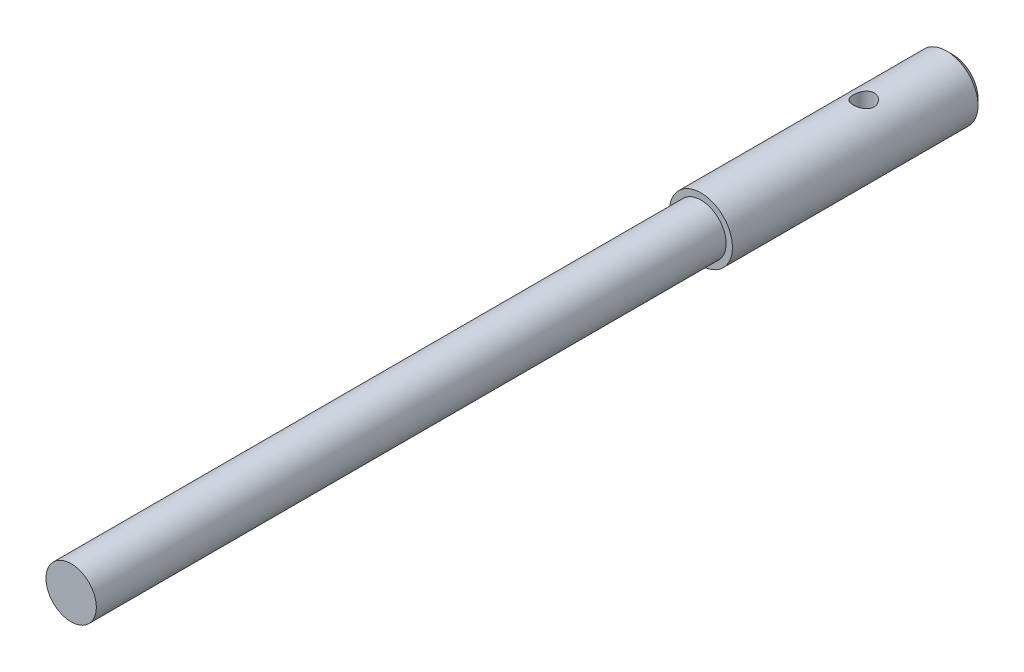
ISO-10303-21;
HEADER;
FILE_DESCRIPTION(('STEP AP214'),'2;1');
FILE_NAME('part.step','',(''),(''),'','','');
FILE_SCHEMA(('AUTOMOTIVE_DESIGN { 1 0 10303 214 1 1 1 1 }'));
ENDSEC;
DATA;
#1=APPLICATION_CONTEXT('core data for automotive mechanical design processes');
#2=APPLICATION_PROTOCOL_DEFINITION('international standard','automotive_design',2000,#1);
#3=PRODUCT_CONTEXT('',#1,'mechanical');
#4=PRODUCT('Part','Part','',(#3));
#5=PRODUCT_RELATED_PRODUCT_CATEGORY('part','',(#4));
#6=PRODUCT_DEFINITION_FORMATION('','',#4);
#7=PRODUCT_DEFINITION_CONTEXT('part definition',#1,'design');
#8=PRODUCT_DEFINITION('design','',#6,#7);
#9=PRODUCT_DEFINITION_SHAPE('','',#8);
#10=(LENGTH_UNIT() NAMED_UNIT(*) SI_UNIT(.MILLI.,.METRE.));
#11=(NAMED_UNIT(*) PLANE_ANGLE_UNIT() SI_UNIT($,.RADIAN.));
#12=(NAMED_UNIT(*) SI_UNIT($,.STERADIAN.) SOLID_ANGLE_UNIT());
#13=UNCERTAINTY_MEASURE_WITH_UNIT(LENGTH_MEASURE(1.E-05),#10,'distance_accuracy_value','');
#14=(GEOMETRIC_REPRESENTATION_CONTEXT(3) GLOBAL_UNCERTAINTY_ASSIGNED_CONTEXT((#13)) GLOBAL_UNIT_ASSIGNED_CONTEXT((#10,
#11,#12)) REPRESENTATION_CONTEXT('',''));
#15=CARTESIAN_POINT('',(0.,0.,0.));
#16=DIRECTION('',(0.,0.,1.));
#17=DIRECTION('',(1.,0.,0.));
#18=AXIS2_PLACEMENT_3D('',#15,#16,#17);
#19=CARTESIAN_POINT('',(9.50000000000006,0.,-12.));
#20=DIRECTION('',(0.,0.,1.));
#21=DIRECTION('',(1.,0.,0.));
#22=AXIS2_PLACEMENT_3D('',#19,#20,#21);
#23=CYLINDRICAL_SURFACE('',#22,1.5);
#24=CARTESIAN_POINT('',(9.49999999999984,-1.50000000000006,-7.25));
#25=CARTESIAN_POINT('',(9.52728168144333,-1.50000007650484,-7.24999987313413));
#26=CARTESIAN_POINT('',(9.55456259726939,-1.4992488475381,-7.25224013306349));
#27=CARTESIAN_POINT('',(9.60832088043676,-1.49632605101601,-7.26111455440851));
#28=CARTESIAN_POINT('',(9.6347981640597,-1.49415433600934,-7.26774917197445));
#29=CARTESIAN_POINT('',(9.68616639475129,-1.48862653953088,-7.28515962169195));
#30=CARTESIAN_POINT('',(9.71105991294352,-1.48527243865406,-7.29592853122936));
#31=CARTESIAN_POINT('',(9.75868746840293,-1.47772222858682,-7.32127058641896));
#32=CARTESIAN_POINT('',(9.78142107847927,-1.47352595333819,-7.33584448250135));
#33=CARTESIAN_POINT('',(9.82487083751114,-1.46457047221613,-7.36891290242945));
#34=CARTESIAN_POINT('',(9.8455018501496,-1.45979778232274,-7.3875156171301));
#35=CARTESIAN_POINT('',(9.88341634635164,-1.45030157391156,-7.42788357735274));
#36=CARTESIAN_POINT('',(9.90069909274505,-1.44557806643812,-7.44964951746354));
#37=CARTESIAN_POINT('',(9.93191247111458,-1.4365666624013,-7.49649255759885));
#38=CARTESIAN_POINT('',(9.94573242911181,-1.43229519643498,-7.52164686986822));
#39=CARTESIAN_POINT('',(9.96890943693901,-1.42487652703606,-7.57408804722657));
#40=CARTESIAN_POINT('',(9.97826784869175,-1.42172898059175,-7.60137425857227));
#41=CARTESIAN_POINT('',(9.99193673075406,-1.41705651655196,-7.65633661075033));
#42=CARTESIAN_POINT('',(9.99640672413918,-1.41548047960053,-7.68396860426265));
#43=CARTESIAN_POINT('',(10.0006705616708,-1.41397828389549,-7.73963187709959));
#44=CARTESIAN_POINT('',(10.0004658508023,-1.41405161530999,-7.76766303036364));
#45=CARTESIAN_POINT('',(9.99550995185092,-1.41579507485374,-7.82196831522035));
#46=CARTESIAN_POINT('',(9.9909669565841,-1.41739207928727,-7.84826420145933));
#47=CARTESIAN_POINT('',(9.97780308142567,-1.42188328867267,-7.89969670980409));
#48=CARTESIAN_POINT('',(9.96918171329586,-1.42477764893397,-7.92483319271759));
#49=CARTESIAN_POINT('',(9.94796952902977,-1.43158955564243,-7.97370637479566));
#50=CARTESIAN_POINT('',(9.93531702435408,-1.43552282896175,-7.9974140127352));
#51=CARTESIAN_POINT('',(9.90644455315221,-1.44396279288219,-8.04243545414035));
#52=CARTESIAN_POINT('',(9.89022355618203,-1.44846964895328,-8.06374856346672));
#53=CARTESIAN_POINT('',(9.85367466634092,-1.45783664583763,-8.10454579908032));
#54=CARTESIAN_POINT('',(9.8331765750384,-1.46270294677386,-8.12387634725488));
#55=CARTESIAN_POINT('',(9.78916978498551,-1.4720346919354,-8.15886563333211));
#56=CARTESIAN_POINT('',(9.76566079783069,-1.47650009769041,-8.17452401908232));
#57=CARTESIAN_POINT('',(9.71597380652327,-1.484585539689,-8.20184815011751));
#58=CARTESIAN_POINT('',(9.68977163820835,-1.48819675004033,-8.21347274567059));
#59=CARTESIAN_POINT('',(9.6356345416823,-1.49410283572203,-8.23210158697813));
#60=CARTESIAN_POINT('',(9.60770021907733,-1.49639816827386,-8.23910743771179));
#61=CARTESIAN_POINT('',(9.55219191476446,-1.49933813535658,-8.24802783301108));
#62=CARTESIAN_POINT('',(9.52465479993238,-1.5000500091683,-8.25014990458634));
#63=CARTESIAN_POINT('',(9.46961246502007,-1.49994451347448,-8.2498336632008));
#64=CARTESIAN_POINT('',(9.44210724034044,-1.49912740209755,-8.24739612001011));
#65=CARTESIAN_POINT('',(9.38874006684824,-1.49610012358624,-8.23819404613194));
#66=CARTESIAN_POINT('',(9.36285359658296,-1.49393099355628,-8.23155689697498));
#67=CARTESIAN_POINT('',(9.31257202071033,-1.48845923415007,-8.2143032777665));
#68=CARTESIAN_POINT('',(9.28817710574553,-1.4851564602329,-8.20368630026628));
#69=CARTESIAN_POINT('',(9.2408558518032,-1.47764465643739,-8.17846478407949));
#70=CARTESIAN_POINT('',(9.21798502039155,-1.47341407378154,-8.16376270335768));
#71=CARTESIAN_POINT('',(9.17496758493242,-1.46452626957874,-8.13090292499296));
#72=CARTESIAN_POINT('',(9.15482181610222,-1.45986891795973,-8.11274417198488));
#73=CARTESIAN_POINT('',(9.11687374609631,-1.45038423991281,-8.07251062449596));
#74=CARTESIAN_POINT('',(9.09921951537622,-1.44555880547609,-8.05029538653311));
#75=CARTESIAN_POINT('',(9.06787123884038,-1.43649986643492,-8.00311421609739));
#76=CARTESIAN_POINT('',(9.05417722604009,-1.43226636676544,-7.97814826069481));
#77=CARTESIAN_POINT('',(9.03120153478893,-1.42491195910152,-7.92616349234671));
#78=CARTESIAN_POINT('',(9.02191093390214,-1.42178880450345,-7.89914896037844));
#79=CARTESIAN_POINT('',(9.00805266660449,-1.41705416199587,-7.84381067493772));
#80=CARTESIAN_POINT('',(9.00348287251908,-1.41544199311329,-7.81548751728339));
#81=CARTESIAN_POINT('',(8.99936185876468,-1.41398929437518,-7.7599014519935));
#82=CARTESIAN_POINT('',(8.99956487134533,-1.41406200172171,-7.73265882987428));
#83=CARTESIAN_POINT('',(9.00437885327343,-1.41575634961812,-7.67861746255019));
#84=CARTESIAN_POINT('',(9.00898956027056,-1.41737789797945,-7.65181869102348));
#85=CARTESIAN_POINT('',(9.02231409343641,-1.42192262139466,-7.59993216849372));
#86=CARTESIAN_POINT('',(9.03094832699318,-1.4248204900777,-7.57482158749668));
#87=CARTESIAN_POINT('',(9.05201031712062,-1.43158199412745,-7.5263862965325));
#88=CARTESIAN_POINT('',(9.06443891572329,-1.43544584382674,-7.50306198440637));
#89=CARTESIAN_POINT('',(9.09336965370849,-1.44391414612047,-7.45775816503819));
#90=CARTESIAN_POINT('',(9.11002587861826,-1.44854355820813,-7.43588174905108));
#91=CARTESIAN_POINT('',(9.14667855843263,-1.45791678141904,-7.39515509330837));
#92=CARTESIAN_POINT('',(9.16667595777426,-1.46266062456274,-7.37630571215601));
#93=CARTESIAN_POINT('',(9.21037922153958,-1.47195015262721,-7.34142779385519));
#94=CARTESIAN_POINT('',(9.23419924325049,-1.47648090900636,-7.3255378261245));
#95=CARTESIAN_POINT('',(9.28432132129773,-1.48462995586318,-7.29800478557483));
#96=CARTESIAN_POINT('',(9.31062274093513,-1.48824847953923,-7.28636062703907));
#97=CARTESIAN_POINT('',(9.3637531764008,-1.49402757534219,-7.26813918375573));
#98=CARTESIAN_POINT('',(9.39050612116279,-1.49624606211252,-7.26135876686834));
#99=CARTESIAN_POINT('',(9.44483979199529,-1.49923203532127,-7.25228985966146));
#100=CARTESIAN_POINT('',(9.47242028721574,-1.49999992265952,-7.25000012825178));
#101=CARTESIAN_POINT('',(9.49999999999984,-1.50000000000006,-7.25));
#102=B_SPLINE_CURVE_WITH_KNOTS('',3,(#24,#25,#26,#27,#28,#29,#30,#31,#32,#33,#34,#35,#36,#37,
#38,#39,#40,#41,#42,#43,#44,#45,#46,#47,#48,#49,#50,#51,#52,#53,#54,#55,#56,#57,#58,#59,#60,#61,
#62,#63,#64,#65,#66,#67,#68,#69,#70,#71,#72,#73,#74,#75,#76,#77,#78,#79,#80,#81,#82,#83,#84,#85,
#86,#87,#88,#89,#90,#91,#92,#93,#94,#95,#96,#97,#98,#99,#100,#101),.UNSPECIFIED.,.T.,.F.,(4,2,2,
2,2,2,2,2,2,2,2,2,2,2,2,2,2,2,2,2,2,2,2,2,2,2,2,2,2,2,2,2,2,2,2,2,2,2,4),(0.,0.0817435530133332,
0.163495592634499,0.245111336435549,0.326743188899627,0.410923421414165,0.49512216643828,
0.581741924117854,0.668335223464632,0.75200962868851,0.835658169894825,0.915484132713877,
0.995319654234993,1.07644085573328,1.1575855127487,1.24296652901443,1.32835572979058,
1.41459202820948,1.50079834434401,1.58326791583351,1.66572356577816,1.7457907898486,
1.82586822637838,1.90805199917655,1.99026090406724,2.07620511436124,2.16215004113227,
2.24792006907946,2.33365142346159,2.41497833024035,2.49630039666313,2.57607793530834,
2.65587319078616,2.73915033336517,2.82245105552483,2.90899830408205,2.99552340566957,
3.07818279177561,3.16081933009637),.UNSPECIFIED.);
#103=CARTESIAN_POINT('',(9.49999999999984,-1.50000000000006,-7.25));
#104=VERTEX_POINT('',#103);
#105=EDGE_CURVE('E52',#104,#104,#102,.T.);
#106=ORIENTED_EDGE('',*,*,#105,.T.);
#107=EDGE_LOOP('',(#106));
#108=FACE_BOUND('',#107,.T.);
#109=CARTESIAN_POINT('',(9.50000000000029,1.50000000000006,-7.25));
#110=CARTESIAN_POINT('',(9.47271831855676,1.50000007650475,-7.24999987313426));
#111=CARTESIAN_POINT('',(9.44543740273072,1.49924884753763,-7.25224013306384));
#112=CARTESIAN_POINT('',(9.3916791195631,1.49632605101647,-7.26111455440872));
#113=CARTESIAN_POINT('',(9.36520183593988,1.49415433601111,-7.2677491719743));
#114=CARTESIAN_POINT('',(9.31383360524852,1.48862653953267,-7.28515962169209));
#115=CARTESIAN_POINT('',(9.28894008705678,1.48527243865457,-7.29592853123016));
#116=CARTESIAN_POINT('',(9.24131253159732,1.47772222858635,-7.32127058641966));
#117=CARTESIAN_POINT('',(9.21857892152043,1.47352595333802,-7.33584448250131));
#118=CARTESIAN_POINT('',(9.17512916248884,1.46457047221633,-7.36891290242943));
#119=CARTESIAN_POINT('',(9.15449814985125,1.45979778232301,-7.38751561713087));
#120=CARTESIAN_POINT('',(9.11658365364936,1.45030157391169,-7.42788357735359));
#121=CARTESIAN_POINT('',(9.09930090725523,1.44557806643805,-7.44964951746367));
#122=CARTESIAN_POINT('',(9.06808752888601,1.43656666240135,-7.49649255759881));
#123=CARTESIAN_POINT('',(9.05426757088985,1.43229519643536,-7.52164686986878));
#124=CARTESIAN_POINT('',(9.03109056306217,1.4248765270365,-7.57408804722721));
#125=CARTESIAN_POINT('',(9.02173215130788,1.42172898059193,-7.60137425857238));
#126=CARTESIAN_POINT('',(9.00806326924591,1.41705651655223,-7.65633661075018));
#127=CARTESIAN_POINT('',(9.00359327586256,1.41548047960115,-7.68396860426272));
#128=CARTESIAN_POINT('',(8.99932943833084,1.41397828389596,-7.73963187709984));
#129=CARTESIAN_POINT('',(8.99953414919737,1.41405161530998,-7.76766303036385));
#130=CARTESIAN_POINT('',(9.00449004814876,1.41579507485375,-7.82196831522016));
#131=CARTESIAN_POINT('',(9.00903304341732,1.41739207928775,-7.84826420145879));
#132=CARTESIAN_POINT('',(9.02219691857604,1.42188328867317,-7.89969670980369));
#133=CARTESIAN_POINT('',(9.0308182867044,1.42477764893403,-7.92483319271768));
#134=CARTESIAN_POINT('',(9.05203047097021,1.43158955564236,-7.97370637479553));
#135=CARTESIAN_POINT('',(9.06468297564707,1.43552282896202,-7.99741401273433));
#136=CARTESIAN_POINT('',(9.09355544684894,1.44396279288252,-8.04243545413956));
#137=CARTESIAN_POINT('',(9.10977644381791,1.44846964895334,-8.06374856346674));
#138=CARTESIAN_POINT('',(9.14632533365859,1.4578366458376,-8.10454579908041));
#139=CARTESIAN_POINT('',(9.16682342496201,1.46270294677403,-8.12387634725413));
#140=CARTESIAN_POINT('',(9.2108302150154,1.47203469193546,-8.15886563333124));
#141=CARTESIAN_POINT('',(9.23433920216983,1.47650009769016,-8.17452401908217));
#142=CARTESIAN_POINT('',(9.28402619347688,1.48458553968876,-8.20184815011752));
#143=CARTESIAN_POINT('',(9.31022836179179,1.48819675004044,-8.21347274567004));
#144=CARTESIAN_POINT('',(9.36436545831748,1.49410283572188,-8.23210158697749));
#145=CARTESIAN_POINT('',(9.39229978092208,1.49639816827312,-8.23910743771161));
#146=CARTESIAN_POINT('',(9.4478080852347,1.499338135356,-8.2480278330113));
#147=CARTESIAN_POINT('',(9.4753452000669,1.5000500091684,-8.25014990458645));
#148=CARTESIAN_POINT('',(9.53038753497933,1.49994451347438,-8.24983366320071));
#149=CARTESIAN_POINT('',(9.55789275965896,1.49912740209659,-8.24739612000991));
#150=CARTESIAN_POINT('',(9.61125993315143,1.49610012358542,-8.23819404613214));
#151=CARTESIAN_POINT('',(9.63714640341696,1.49393099355642,-8.2315568969757));
#152=CARTESIAN_POINT('',(9.68742797928937,1.48845923415,-8.21430327776706));
#153=CARTESIAN_POINT('',(9.71182289425369,1.48515646023165,-8.20368630026618));
#154=CARTESIAN_POINT('',(9.75914414819636,1.47764465643597,-8.17846478407955));
#155=CARTESIAN_POINT('',(9.78201497960887,1.47341407378117,-8.1637627033586));
#156=CARTESIAN_POINT('',(9.82503241506811,1.46452626957897,-8.13090292499389));
#157=CARTESIAN_POINT('',(9.84517818389756,1.45986891795949,-8.11274417198497));
#158=CARTESIAN_POINT('',(9.88312625390372,1.45038423991216,-8.07251062449587));
#159=CARTESIAN_POINT('',(9.90078048462491,1.44555880547553,-8.05029538653375));
#160=CARTESIAN_POINT('',(9.93212876116094,1.43649986643485,-8.00311421609814));
#161=CARTESIAN_POINT('',(9.94582277396034,1.43226636676576,-7.97814826069494));
#162=CARTESIAN_POINT('',(9.96879846521177,1.42491195910164,-7.92616349234663));
#163=CARTESIAN_POINT('',(9.97808906609974,1.42178880450298,-7.89914896037878));
#164=CARTESIAN_POINT('',(9.99194733339681,1.41705416199535,-7.84381067493817));
#165=CARTESIAN_POINT('',(9.99651712748046,1.41544199311331,-7.81548751728356));
#166=CARTESIAN_POINT('',(10.0006381412351,1.41398929437517,-7.75990145199331));
#167=CARTESIAN_POINT('',(10.0004351286563,1.41406200172118,-7.73265882987402));
#168=CARTESIAN_POINT('',(9.99562114672825,1.41575634961757,-7.6786174625501));
#169=CARTESIAN_POINT('',(9.99101043972928,1.41737789797942,-7.65181869102363));
#170=CARTESIAN_POINT('',(9.97768590656314,1.42192262139469,-7.59993216849367));
#171=CARTESIAN_POINT('',(9.96905167300785,1.42482049007729,-7.5748215874962));
#172=CARTESIAN_POINT('',(9.94798968288129,1.431581994127,-7.526386296532));
#173=CARTESIAN_POINT('',(9.93556108427803,1.43544584382667,-7.50306198440628));
#174=CARTESIAN_POINT('',(9.90663034629257,1.44391414612056,-7.45775816503813));
#175=CARTESIAN_POINT('',(9.88997412138317,1.44854355820798,-7.43588174905061));
#176=CARTESIAN_POINT('',(9.8533214415685,1.4579167814186,-7.39515509330795));
#177=CARTESIAN_POINT('',(9.8333240422262,1.46266062456226,-7.37630571215604));
#178=CARTESIAN_POINT('',(9.78962077846065,1.47195015262675,-7.34142779385533));
#179=CARTESIAN_POINT('',(9.76580075675025,1.47648090900598,-7.32553782612421));
#180=CARTESIAN_POINT('',(9.7156786787036,1.48462995586327,-7.29800478557441));
#181=CARTESIAN_POINT('',(9.6893772590663,1.48824847953971,-7.28636062703894));
#182=CARTESIAN_POINT('',(9.63624682360054,1.49402757534264,-7.26813918375573));
#183=CARTESIAN_POINT('',(9.60949387883836,1.49624606211257,-7.26135876686824));
#184=CARTESIAN_POINT('',(9.55516020800538,1.49923203532114,-7.25228985966129));
#185=CARTESIAN_POINT('',(9.52757971278462,1.49999992265961,-7.25000012825164));
#186=CARTESIAN_POINT('',(9.50000000000029,1.50000000000006,-7.25));
#187=B_SPLINE_CURVE_WITH_KNOTS('',3,(#109,#110,#111,#112,#113,#114,#115,#116,#117,#118,#119,
#120,#121,#122,#123,#124,#125,#126,#127,#128,#129,#130,#131,#132,#133,#134,#135,#136,#137,#138,
#139,#140,#141,#142,#143,#144,#145,#146,#147,#148,#149,#150,#151,#152,#153,#154,#155,#156,#157,
#158,#159,#160,#161,#162,#163,#164,#165,#166,#167,#168,#169,#170,#171,#172,#173,#174,#175,#176,
#177,#178,#179,#180,#181,#182,#183,#184,#185,#186),.UNSPECIFIED.,.T.,.F.,(4,2,2,2,2,2,2,2,2,2,2,
2,2,2,2,2,2,2,2,2,2,2,2,2,2,2,2,2,2,2,2,2,2,2,2,2,2,2,4),(0.,0.081743553013526,
0.163495592634748,0.245111336435758,0.326743188899849,0.410923421414062,0.495122166437868,
0.581741924117451,0.668335223464204,0.752009628687922,0.835658169894062,0.915484132712989,
0.995319654234043,1.07644085573213,1.15758551274727,1.24296652901315,1.32835572978955,
1.4145920282078,1.5007983443416,1.58326791583132,1.66572356577624,1.74579078984668,
1.82586822637646,1.90805199917487,1.99026090406583,2.07620511436008,2.16215004113132,
2.24792006907854,2.33365142346073,2.41497833023964,2.49630039666262,2.5760779353077,
2.65587319078523,2.73915033336449,2.8224510555246,2.90899830408144,2.99552340566837,
3.07818279177502,3.16081933009657),.UNSPECIFIED.);
#188=CARTESIAN_POINT('',(9.50000000000029,1.50000000000006,-7.25));
#189=VERTEX_POINT('',#188);
#190=EDGE_CURVE('E132',#189,#189,#187,.T.);
#191=ORIENTED_EDGE('',*,*,#190,.T.);
#192=EDGE_LOOP('',(#191));
#193=FACE_BOUND('',#192,.T.);
#194=CARTESIAN_POINT('',(9.50000000000006,0.,-11.7));
#195=DIRECTION('',(0.,0.,-1.));
#196=DIRECTION('',(-1.,0.,0.));
#197=AXIS2_PLACEMENT_3D('',#194,#195,#196);
#198=CIRCLE('',#197,1.5);
#199=CARTESIAN_POINT('',(8.49999999999984,-1.11803398874999,-11.7));
#200=VERTEX_POINT('',#199);
#201=CARTESIAN_POINT('',(8.49999999999929,1.11803398874999,-11.7));
#202=VERTEX_POINT('',#201);
#203=EDGE_CURVE('E102',#200,#202,#198,.F.);
#204=ORIENTED_EDGE('',*,*,#203,.T.);
#205=DIRECTION('',(0.,0.,1.));
#206=VECTOR('',#205,1.);
#207=CARTESIAN_POINT('',(8.49999999999929,1.11803398874999,-12.));
#208=LINE('',#207,#206);
#209=CARTESIAN_POINT('',(8.49999999999929,1.11803398874999,-6.));
#210=VERTEX_POINT('',#209);
#211=EDGE_CURVE('E77',#202,#210,#208,.T.);
#212=ORIENTED_EDGE('',*,*,#211,.T.);
#213=CARTESIAN_POINT('',(9.50000000000006,0.,-6.));
#214=DIRECTION('',(0.,0.,-1.));
#215=DIRECTION('',(-1.,0.,0.));
#216=AXIS2_PLACEMENT_3D('',#213,#214,#215);
#217=CIRCLE('',#216,1.5);
#218=CARTESIAN_POINT('',(8.49999999999984,-1.11803398874999,-6.));
#219=VERTEX_POINT('',#218);
#220=EDGE_CURVE('E65',#219,#210,#217,.T.);
#221=ORIENTED_EDGE('',*,*,#220,.F.);
#222=DIRECTION('',(0.,0.,1.));
#223=VECTOR('',#222,1.);
#224=CARTESIAN_POINT('',(8.49999999999984,-1.11803398874999,-12.));
#225=LINE('',#224,#223);
#226=EDGE_CURVE('E109',#219,#200,#225,.F.);
#227=ORIENTED_EDGE('',*,*,#226,.T.);
#228=EDGE_LOOP('',(#204,#212,#221,#227));
#229=FACE_BOUND('',#228,.T.);
#230=CARTESIAN_POINT('',(9.5,0.,0.));
#231=DIRECTION('',(0.,0.,-1.));
#232=DIRECTION('',(-1.,0.,0.));
#233=AXIS2_PLACEMENT_3D('',#230,#231,#232);
#234=CIRCLE('',#233,1.5);
#235=CARTESIAN_POINT('',(8.,0.,0.));
#236=VERTEX_POINT('',#235);
#237=EDGE_CURVE('E140',#236,#236,#234,.T.);
#238=ORIENTED_EDGE('',*,*,#237,.T.);
#239=EDGE_LOOP('',(#238));
#240=FACE_BOUND('',#239,.T.);
#241=ADVANCED_FACE('F50',(#108,#193,#229,#240),#23,.T.);
#242=CARTESIAN_POINT('',(9.50000000000006,0.,-12.));
#243=DIRECTION('',(0.,0.,-1.));
#244=DIRECTION('',(-1.,0.,0.));
#245=AXIS2_PLACEMENT_3D('',#242,#243,#244);
#246=PLANE('',#245);
#247=DIRECTION('',(0.,-1.,0.));
#248=VECTOR('',#247,1.);
#249=CARTESIAN_POINT('',(8.50000000000006,1.74994964743513,-12.));
#250=LINE('',#249,#248);
#251=CARTESIAN_POINT('',(8.49999999999984,0.663324958070977,-12.));
#252=VERTEX_POINT('',#251);
#253=CARTESIAN_POINT('',(8.50000000000006,-0.663324958070977,-12.));
#254=VERTEX_POINT('',#253);
#255=EDGE_CURVE('E69',#252,#254,#250,.T.);
#256=ORIENTED_EDGE('',*,*,#255,.F.);
#257=CARTESIAN_POINT('',(9.50000000000006,0.,-12.));
#258=DIRECTION('',(0.,0.,-1.));
#259=DIRECTION('',(-1.,0.,0.));
#260=AXIS2_PLACEMENT_3D('',#257,#258,#259);
#261=CIRCLE('',#260,1.19999999999995);
#262=EDGE_CURVE('E97',#252,#254,#261,.T.);
#263=ORIENTED_EDGE('',*,*,#262,.T.);
#264=EDGE_LOOP('',(#256,#263));
#265=FACE_BOUND('',#264,.T.);
#266=ADVANCED_FACE('F98',(#265),#246,.T.);
#267=CARTESIAN_POINT('',(9.50000000000006,0.,-12.));
#268=DIRECTION('',(0.,0.,1.));
#269=DIRECTION('',(1.,0.,0.));
#270=AXIS2_PLACEMENT_3D('',#267,#268,#269);
#271=CONICAL_SURFACE('',#270,1.19999999999995,0.78539816339747);
#272=CARTESIAN_POINT('',(8.49999999999984,1.1189729621397,-11.6993));
#273=CARTESIAN_POINT('',(8.49999999999998,1.09024222016774,-11.7207187328309));
#274=CARTESIAN_POINT('',(8.50000000000004,1.06134026006011,-11.7419071026152));
#275=CARTESIAN_POINT('',(8.50000000000008,1.00312061656165,-11.7837236259048));
#276=CARTESIAN_POINT('',(8.50000000000007,0.973802805615043,-11.8043516016031));
#277=CARTESIAN_POINT('',(8.50000000000005,0.884567468967812,-11.8656206176181));
#278=CARTESIAN_POINT('',(8.50000000000008,0.823924913388789,-11.9052254029844));
#279=CARTESIAN_POINT('',(8.50000000000004,0.696784081134298,-11.9822962516307));
#280=CARTESIAN_POINT('',(8.49999999999997,0.630146054569374,-12.0195349699332));
#281=CARTESIAN_POINT('',(8.50000000000015,0.493354129612665,-12.0865050319626));
#282=CARTESIAN_POINT('',(8.5000000000004,0.423216912285458,-12.1162685490798));
#283=CARTESIAN_POINT('',(8.50000000000023,0.3172022454351,-12.1513827077401));
#284=CARTESIAN_POINT('',(8.50000000000009,0.282850113782154,-12.1613149000477));
#285=CARTESIAN_POINT('',(8.50000000000003,0.213373247303071,-12.1780449996244));
#286=CARTESIAN_POINT('',(8.50000000000011,0.178248488865771,-12.1848428109683));
#287=CARTESIAN_POINT('',(8.50000000000002,0.108142066473056,-12.1947564692436));
#288=CARTESIAN_POINT('',(8.49999999999986,0.0731699498528852,-12.1979386170484));
#289=CARTESIAN_POINT('',(8.50000000000027,0.00308421194422297,-12.2006082365864));
#290=CARTESIAN_POINT('',(8.50000000000084,-0.0320293978936912,-12.200096001522));
#291=CARTESIAN_POINT('',(8.50000000000084,-0.10197216232857,-12.1954199205539));
#292=CARTESIAN_POINT('',(8.50000000000027,-0.136801563849271,-12.1912596856238));
#293=CARTESIAN_POINT('',(8.49999999999985,-0.205897926419616,-12.1795919858713));
#294=CARTESIAN_POINT('',(8.50000000000001,-0.240164653325915,-12.1720831624685));
#295=CARTESIAN_POINT('',(8.50000000000011,-0.308544265543451,-12.1540120518751));
#296=CARTESIAN_POINT('',(8.50000000000005,-0.342642782255064,-12.1433962477893));
#297=CARTESIAN_POINT('',(8.50000000000007,-0.409953485208605,-12.1196898228485));
#298=CARTESIAN_POINT('',(8.50000000000015,-0.443165687264673,-12.1065992461836));
#299=CARTESIAN_POINT('',(8.50000000000022,-0.535214038947442,-12.0670481624514));
#300=CARTESIAN_POINT('',(8.5000000000001,-0.593075519908674,-12.0383299431418));
#301=CARTESIAN_POINT('',(8.50000000000002,-0.706482517486803,-11.9765388022821));
#302=CARTESIAN_POINT('',(8.50000000000006,-0.762023712509283,-11.9434581936325));
#303=CARTESIAN_POINT('',(8.50000000000007,-0.868579685508096,-11.876064367498));
#304=CARTESIAN_POINT('',(8.50000000000005,-0.919683166917521,-11.8418896681839));
#305=CARTESIAN_POINT('',(8.50000000000008,-1.020339725886,-11.7717707222928));
#306=CARTESIAN_POINT('',(8.50000000000013,-1.06989854885262,-11.7358347605054));
#307=CARTESIAN_POINT('',(8.50000000000028,-1.1189729621397,-11.6993));
#308=B_SPLINE_CURVE_WITH_KNOTS('',3,(#272,#273,#274,#275,#276,#277,#278,#279,#280,#281,#282,
#283,#284,#285,#286,#287,#288,#289,#290,#291,#292,#293,#294,#295,#296,#297,#298,#299,#300,#301,
#302,#303,#304,#305,#306,#307),.UNSPECIFIED.,.F.,.F.,(4,2,2,2,2,2,2,2,2,2,2,2,2,2,2,2,2,4),(0.,
0.107504690946455,0.215043102750907,0.43221333433738,0.660987336316845,0.888759133201842,
0.995917363996237,1.10307887406487,1.20824192609603,1.31339663202142,1.41844736788702,
1.52354076348759,1.63056316104871,1.73758364777572,1.93106053361932,2.12488302407792,
2.30926491601909,2.49285004928348),.UNSPECIFIED.);
#309=EDGE_CURVE('E87',#202,#252,#308,.T.);
#310=ORIENTED_EDGE('',*,*,#309,.F.);
#311=ORIENTED_EDGE('',*,*,#203,.F.);
#312=EDGE_CURVE('E94',#254,#200,#308,.T.);
#313=ORIENTED_EDGE('',*,*,#312,.F.);
#314=ORIENTED_EDGE('',*,*,#262,.F.);
#315=EDGE_LOOP('',(#310,#311,#313,#314));
#316=FACE_BOUND('',#315,.T.);
#317=ADVANCED_FACE('F49',(#316),#271,.T.);
#318=CARTESIAN_POINT('',(0.,0.,-5.99999999999999));
#319=DIRECTION('',(0.,0.,-1.));
#320=DIRECTION('',(-1.,0.,0.));
#321=AXIS2_PLACEMENT_3D('',#318,#319,#320);
#322=PLANE('',#321);
#323=ORIENTED_EDGE('',*,*,#220,.T.);
#324=DIRECTION('',(0.,-1.,0.));
#325=VECTOR('',#324,1.);
#326=CARTESIAN_POINT('',(8.50000000000006,1.74994964743513,-6.));
#327=LINE('',#326,#325);
#328=EDGE_CURVE('E101',#210,#219,#327,.T.);
#329=ORIENTED_EDGE('',*,*,#328,.T.);
#330=EDGE_LOOP('',(#323,#329));
#331=FACE_BOUND('',#330,.T.);
#332=ADVANCED_FACE('F124',(#331),#322,.T.);
#333=CARTESIAN_POINT('',(8.50000000000006,1.74994964743513,-6.));
#334=DIRECTION('',(1.,0.,0.));
#335=DIRECTION('',(0.,1.,0.));
#336=AXIS2_PLACEMENT_3D('',#333,#334,#335);
#337=PLANE('',#336);
#338=ORIENTED_EDGE('',*,*,#309,.T.);
#339=ORIENTED_EDGE('',*,*,#255,.T.);
#340=ORIENTED_EDGE('',*,*,#312,.T.);
#341=ORIENTED_EDGE('',*,*,#226,.F.);
#342=ORIENTED_EDGE('',*,*,#328,.F.);
#343=ORIENTED_EDGE('',*,*,#211,.F.);
#344=EDGE_LOOP('',(#338,#339,#340,#341,#342,#343));
#345=FACE_BOUND('',#344,.T.);
#346=ADVANCED_FACE('F86',(#345),#337,.F.);
#347=CARTESIAN_POINT('',(9.50000000000084,-2.99999999999967,-7.75));
#348=DIRECTION('',(0.,1.,0.));
#349=DIRECTION('',(0.,0.,1.));
#350=AXIS2_PLACEMENT_3D('',#347,#348,#349);
#351=CYLINDRICAL_SURFACE('',#350,0.5);
#352=ORIENTED_EDGE('',*,*,#190,.F.);
#353=EDGE_LOOP('',(#352));
#354=FACE_BOUND('',#353,.T.);
#355=ORIENTED_EDGE('',*,*,#105,.F.);
#356=EDGE_LOOP('',(#355));
#357=FACE_BOUND('',#356,.T.);
#358=ADVANCED_FACE('F122',(#354,#357),#351,.F.);
#359=CARTESIAN_POINT('',(9.5,0.,0.));
#360=DIRECTION('',(0.,0.,1.));
#361=DIRECTION('',(1.,0.,0.));
#362=AXIS2_PLACEMENT_3D('',#359,#360,#361);
#363=PLANE('',#362);
#364=CARTESIAN_POINT('',(9.5,0.,0.));
#365=DIRECTION('',(0.,0.,1.));
#366=DIRECTION('',(1.,0.,0.));
#367=AXIS2_PLACEMENT_3D('',#364,#365,#366);
#368=CIRCLE('',#367,1.2);
#369=CARTESIAN_POINT('',(10.7,0.,0.));
#370=VERTEX_POINT('',#369);
#371=EDGE_CURVE('E11',#370,#370,#368,.T.);
#372=ORIENTED_EDGE('',*,*,#371,.F.);
#373=EDGE_LOOP('',(#372));
#374=FACE_BOUND('',#373,.T.);
#375=ORIENTED_EDGE('',*,*,#237,.F.);
#376=EDGE_LOOP('',(#375));
#377=FACE_BOUND('',#376,.T.);
#378=ADVANCED_FACE('F143',(#374,#377),#363,.T.);
#379=CARTESIAN_POINT('',(9.5,0.,30.));
#380=DIRECTION('',(0.,0.,-1.));
#381=DIRECTION('',(-1.,0.,0.));
#382=AXIS2_PLACEMENT_3D('',#379,#380,#381);
#383=CYLINDRICAL_SURFACE('',#382,1.2);
#384=CARTESIAN_POINT('',(9.5,0.,30.));
#385=DIRECTION('',(0.,0.,1.));
#386=DIRECTION('',(1.,0.,0.));
#387=AXIS2_PLACEMENT_3D('',#384,#385,#386);
#388=CIRCLE('',#387,1.2);
#389=CARTESIAN_POINT('',(10.7,0.,30.));
#390=VERTEX_POINT('',#389);
#391=EDGE_CURVE('E158',#390,#390,#388,.T.);
#392=ORIENTED_EDGE('',*,*,#391,.F.);
#393=EDGE_LOOP('',(#392));
#394=FACE_BOUND('',#393,.T.);
#395=ORIENTED_EDGE('',*,*,#371,.T.);
#396=EDGE_LOOP('',(#395));
#397=FACE_BOUND('',#396,.T.);
#398=ADVANCED_FACE('F148',(#394,#397),#383,.T.);
#399=CARTESIAN_POINT('',(9.5,0.,30.));
#400=DIRECTION('',(0.,0.,1.));
#401=DIRECTION('',(1.,0.,0.));
#402=AXIS2_PLACEMENT_3D('',#399,#400,#401);
#403=PLANE('',#402);
#404=ORIENTED_EDGE('',*,*,#391,.T.);
#405=EDGE_LOOP('',(#404));
#406=FACE_BOUND('',#405,.T.);
#407=ADVANCED_FACE('F147',(#406),#403,.T.);
#408=CLOSED_SHELL('',(#241,#266,#317,#332,#346,#358,#378,#398,#407));
#409=MANIFOLD_SOLID_BREP('B2',#408);
#410=ADVANCED_BREP_SHAPE_REPRESENTATION('',(#18,#409),#14);
#411=SHAPE_DEFINITION_REPRESENTATION(#9,#410);
ENDSEC;
END-ISO-10303-21;
